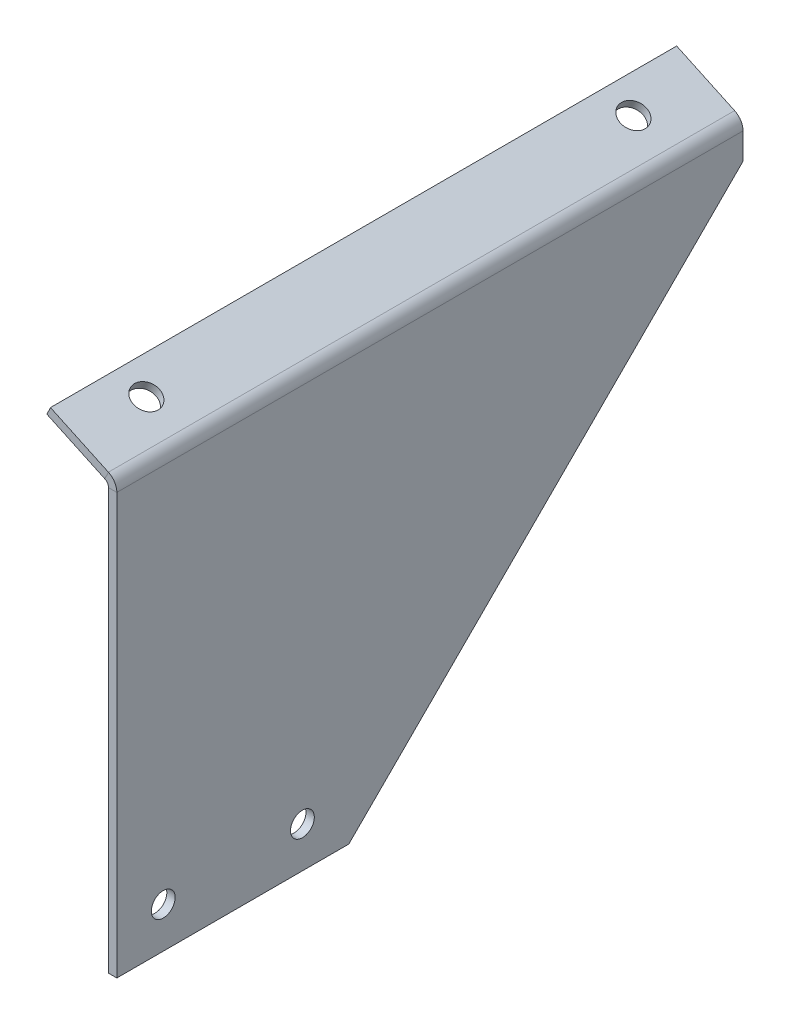
ISO-10303-21;
HEADER;
FILE_DESCRIPTION(('STEP AP214'),'2;1');
FILE_NAME('part.step','',(''),(''),'','','');
FILE_SCHEMA(('AUTOMOTIVE_DESIGN { 1 0 10303 214 1 1 1 1 }'));
ENDSEC;
DATA;
#1=APPLICATION_CONTEXT('core data for automotive mechanical design processes');
#2=APPLICATION_PROTOCOL_DEFINITION('international standard','automotive_design',2000,#1);
#3=PRODUCT_CONTEXT('',#1,'mechanical');
#4=PRODUCT('Part','Part','',(#3));
#5=PRODUCT_RELATED_PRODUCT_CATEGORY('part','',(#4));
#6=PRODUCT_DEFINITION_FORMATION('','',#4);
#7=PRODUCT_DEFINITION_CONTEXT('part definition',#1,'design');
#8=PRODUCT_DEFINITION('design','',#6,#7);
#9=PRODUCT_DEFINITION_SHAPE('','',#8);
#10=(LENGTH_UNIT() NAMED_UNIT(*) SI_UNIT(.MILLI.,.METRE.));
#11=(NAMED_UNIT(*) PLANE_ANGLE_UNIT() SI_UNIT($,.RADIAN.));
#12=(NAMED_UNIT(*) SI_UNIT($,.STERADIAN.) SOLID_ANGLE_UNIT());
#13=UNCERTAINTY_MEASURE_WITH_UNIT(LENGTH_MEASURE(1.E-05),#10,'distance_accuracy_value','');
#14=(GEOMETRIC_REPRESENTATION_CONTEXT(3) GLOBAL_UNCERTAINTY_ASSIGNED_CONTEXT((#13)) GLOBAL_UNIT_ASSIGNED_CONTEXT((#10,
#11,#12)) REPRESENTATION_CONTEXT('',''));
#15=CARTESIAN_POINT('',(0.,0.,0.));
#16=DIRECTION('',(0.,0.,1.));
#17=DIRECTION('',(1.,0.,0.));
#18=AXIS2_PLACEMENT_3D('',#15,#16,#17);
#19=CARTESIAN_POINT('',(103.876646538922,66.7332248992325,31.75));
#20=DIRECTION('',(0.422618261740697,0.906307787036651,0.));
#21=DIRECTION('',(0.,0.,-1.));
#22=AXIS2_PLACEMENT_3D('',#19,#20,#21);
#23=PLANE('',#22);
#24=CARTESIAN_POINT('',(-11.9380691662453,120.738513759596,12.7));
#25=DIRECTION('',(0.422618261740697,0.906307787036651,0.));
#26=DIRECTION('',(0.,0.,-1.));
#27=AXIS2_PLACEMENT_3D('',#24,#25,#26);
#28=CIRCLE('',#27,3.56869999999998);
#29=CARTESIAN_POINT('',(-11.9380691662453,120.738513759596,9.13130000000002));
#30=VERTEX_POINT('',#29);
#31=EDGE_CURVE('E189',#30,#30,#28,.F.);
#32=ORIENTED_EDGE('',*,*,#31,.F.);
#33=EDGE_LOOP('',(#32));
#34=FACE_BOUND('',#33,.T.);
#35=CARTESIAN_POINT('',(-11.9380691662453,120.738513759596,-120.65));
#36=DIRECTION('',(0.422618261740697,0.906307787036651,0.));
#37=DIRECTION('',(0.,0.,-1.));
#38=AXIS2_PLACEMENT_3D('',#35,#36,#37);
#39=CIRCLE('',#38,3.5687);
#40=CARTESIAN_POINT('',(-11.9380691662453,120.738513759596,-124.2187));
#41=VERTEX_POINT('',#40);
#42=EDGE_CURVE('E182',#41,#41,#39,.F.);
#43=ORIENTED_EDGE('',*,*,#42,.F.);
#44=EDGE_LOOP('',(#43));
#45=FACE_BOUND('',#44,.T.);
#46=DIRECTION('',(-0.906307787036651,0.422618261740697,0.));
#47=VECTOR('',#46,1.);
#48=CARTESIAN_POINT('',(6.0407209283152,112.354866254141,-139.7));
#49=LINE('',#48,#47);
#50=CARTESIAN_POINT('',(-3.28325373832147,116.702707045637,-139.7));
#51=VERTEX_POINT('',#50);
#52=CARTESIAN_POINT('',(-19.1433973347441,124.098413464087,-139.7));
#53=VERTEX_POINT('',#52);
#54=EDGE_CURVE('E46',#51,#53,#49,.T.);
#55=ORIENTED_EDGE('',*,*,#54,.F.);
#56=DIRECTION('',(0.,0.,1.));
#57=VECTOR('',#56,1.);
#58=CARTESIAN_POINT('',(-3.28325373832147,116.702707045637,31.75));
#59=LINE('',#58,#57);
#60=CARTESIAN_POINT('',(-3.28325373832147,116.702707045637,31.75));
#61=VERTEX_POINT('',#60);
#62=EDGE_CURVE('E139',#51,#61,#59,.T.);
#63=ORIENTED_EDGE('',*,*,#62,.T.);
#64=DIRECTION('',(0.906307787036651,-0.422618261740697,0.));
#65=VECTOR('',#64,1.);
#66=CARTESIAN_POINT('',(-19.1433973347441,124.098413464087,31.75));
#67=LINE('',#66,#65);
#68=CARTESIAN_POINT('',(-19.1433973347441,124.098413464087,31.75));
#69=VERTEX_POINT('',#68);
#70=EDGE_CURVE('E198',#69,#61,#67,.T.);
#71=ORIENTED_EDGE('',*,*,#70,.F.);
#72=DIRECTION('',(0.,0.,1.));
#73=VECTOR('',#72,1.);
#74=CARTESIAN_POINT('',(-19.1433973347441,124.098413464087,-139.7));
#75=LINE('',#74,#73);
#76=EDGE_CURVE('E192',#53,#69,#75,.T.);
#77=ORIENTED_EDGE('',*,*,#76,.F.);
#78=EDGE_LOOP('',(#55,#63,#71,#77));
#79=FACE_BOUND('',#78,.T.);
#80=ADVANCED_FACE('F42',(#34,#45,#79),#23,.F.);
#81=CARTESIAN_POINT('',(-19.1433973347441,124.098413464087,31.75));
#82=DIRECTION('',(0.,0.,1.));
#83=DIRECTION('',(0.906307787036651,-0.422618261740697,0.));
#84=AXIS2_PLACEMENT_3D('',#81,#82,#83);
#85=PLANE('',#84);
#86=DIRECTION('',(-0.422618261740697,-0.906307787036651,0.));
#87=VECTOR('',#86,1.);
#88=CARTESIAN_POINT('',(-3.28325373832147,116.702707045637,31.75));
#89=LINE('',#88,#87);
#90=CARTESIAN_POINT('',(-2.31714839198224,118.774526646803,31.75));
#91=VERTEX_POINT('',#90);
#92=EDGE_CURVE('E12',#91,#61,#89,.T.);
#93=ORIENTED_EDGE('',*,*,#92,.F.);
#94=DIRECTION('',(0.906307787036651,-0.422618261740697,0.));
#95=VECTOR('',#94,1.);
#96=CARTESIAN_POINT('',(-18.1772919884048,126.170233065252,31.75));
#97=LINE('',#96,#95);
#98=CARTESIAN_POINT('',(-18.1772919884048,126.170233065252,31.75));
#99=VERTEX_POINT('',#98);
#100=EDGE_CURVE('E59',#99,#91,#97,.T.);
#101=ORIENTED_EDGE('',*,*,#100,.F.);
#102=DIRECTION('',(0.422618261740697,0.906307787036651,0.));
#103=VECTOR('',#102,1.);
#104=CARTESIAN_POINT('',(-19.1433973347441,124.098413464087,31.75));
#105=LINE('',#104,#103);
#106=EDGE_CURVE('E199',#69,#99,#105,.T.);
#107=ORIENTED_EDGE('',*,*,#106,.F.);
#108=ORIENTED_EDGE('',*,*,#70,.T.);
#109=EDGE_LOOP('',(#93,#101,#107,#108));
#110=FACE_BOUND('',#109,.T.);
#111=ADVANCED_FACE('F44',(#110),#85,.T.);
#112=CARTESIAN_POINT('',(-19.1433973347441,124.098413464087,-139.7));
#113=DIRECTION('',(-0.906307787036651,0.422618261740697,0.));
#114=DIRECTION('',(0.,0.,1.));
#115=AXIS2_PLACEMENT_3D('',#112,#113,#114);
#116=PLANE('',#115);
#117=DIRECTION('',(0.,0.,1.));
#118=VECTOR('',#117,1.);
#119=CARTESIAN_POINT('',(-18.1772919884049,126.170233065252,-139.7));
#120=LINE('',#119,#118);
#121=CARTESIAN_POINT('',(-18.1772919884049,126.170233065252,-139.7));
#122=VERTEX_POINT('',#121);
#123=EDGE_CURVE('E196',#122,#99,#120,.T.);
#124=ORIENTED_EDGE('',*,*,#123,.F.);
#125=DIRECTION('',(0.422618261740697,0.906307787036651,0.));
#126=VECTOR('',#125,1.);
#127=CARTESIAN_POINT('',(-19.1433973347441,124.098413464087,-139.7));
#128=LINE('',#127,#126);
#129=EDGE_CURVE('E195',#53,#122,#128,.T.);
#130=ORIENTED_EDGE('',*,*,#129,.F.);
#131=ORIENTED_EDGE('',*,*,#76,.T.);
#132=ORIENTED_EDGE('',*,*,#106,.T.);
#133=EDGE_LOOP('',(#124,#130,#131,#132));
#134=FACE_BOUND('',#133,.T.);
#135=ADVANCED_FACE('F215',(#134),#116,.T.);
#136=CARTESIAN_POINT('',(6.0407209283152,112.354866254141,-139.7));
#137=DIRECTION('',(0.,0.,-1.));
#138=DIRECTION('',(-0.422618261740697,-0.906307787036651,0.));
#139=AXIS2_PLACEMENT_3D('',#136,#137,#138);
#140=PLANE('',#139);
#141=DIRECTION('',(0.422618261740697,0.906307787036651,0.));
#142=VECTOR('',#141,1.);
#143=CARTESIAN_POINT('',(-3.28325373832147,116.702707045637,-139.7));
#144=LINE('',#143,#142);
#145=CARTESIAN_POINT('',(-2.31714839198224,118.774526646803,-139.7));
#146=VERTEX_POINT('',#145);
#147=EDGE_CURVE('E203',#51,#146,#144,.T.);
#148=ORIENTED_EDGE('',*,*,#147,.F.);
#149=ORIENTED_EDGE('',*,*,#54,.T.);
#150=ORIENTED_EDGE('',*,*,#129,.T.);
#151=DIRECTION('',(-0.906307787036651,0.422618261740697,0.));
#152=VECTOR('',#151,1.);
#153=CARTESIAN_POINT('',(7.00682627465443,114.426685855307,-139.7));
#154=LINE('',#153,#152);
#155=EDGE_CURVE('E67',#146,#122,#154,.T.);
#156=ORIENTED_EDGE('',*,*,#155,.F.);
#157=EDGE_LOOP('',(#148,#149,#150,#156));
#158=FACE_BOUND('',#157,.T.);
#159=ADVANCED_FACE('F212',(#158),#140,.T.);
#160=CARTESIAN_POINT('',(104.842751885261,68.8050445003983,31.75));
#161=DIRECTION('',(0.422618261740697,0.906307787036651,0.));
#162=DIRECTION('',(0.,0.,-1.));
#163=AXIS2_PLACEMENT_3D('',#160,#161,#162);
#164=PLANE('',#163);
#165=DIRECTION('',(0.,0.,1.));
#166=VECTOR('',#165,1.);
#167=CARTESIAN_POINT('',(-2.31714839198224,118.774526646803,31.75));
#168=LINE('',#167,#166);
#169=EDGE_CURVE('E51',#146,#91,#168,.T.);
#170=ORIENTED_EDGE('',*,*,#169,.F.);
#171=ORIENTED_EDGE('',*,*,#155,.T.);
#172=ORIENTED_EDGE('',*,*,#123,.T.);
#173=ORIENTED_EDGE('',*,*,#100,.T.);
#174=EDGE_LOOP('',(#170,#171,#172,#173));
#175=FACE_BOUND('',#174,.T.);
#176=CARTESIAN_POINT('',(-10.9719638199061,122.810333360761,-120.65));
#177=DIRECTION('',(0.422618261740697,0.906307787036651,0.));
#178=DIRECTION('',(0.,0.,-1.));
#179=AXIS2_PLACEMENT_3D('',#176,#177,#178);
#180=CIRCLE('',#179,3.5687);
#181=CARTESIAN_POINT('',(-10.9719638199061,122.810333360761,-124.2187));
#182=VERTEX_POINT('',#181);
#183=EDGE_CURVE('E179',#182,#182,#180,.T.);
#184=ORIENTED_EDGE('',*,*,#183,.F.);
#185=EDGE_LOOP('',(#184));
#186=FACE_BOUND('',#185,.T.);
#187=CARTESIAN_POINT('',(-10.9719638199061,122.810333360761,12.7));
#188=DIRECTION('',(0.422618261740697,0.906307787036651,0.));
#189=DIRECTION('',(0.,0.,-1.));
#190=AXIS2_PLACEMENT_3D('',#187,#188,#189);
#191=CIRCLE('',#190,3.56869999999998);
#192=CARTESIAN_POINT('',(-10.9719638199061,122.810333360761,9.13130000000002));
#193=VERTEX_POINT('',#192);
#194=EDGE_CURVE('E186',#193,#193,#191,.T.);
#195=ORIENTED_EDGE('',*,*,#194,.F.);
#196=EDGE_LOOP('',(#195));
#197=FACE_BOUND('',#196,.T.);
#198=ADVANCED_FACE('F208',(#175,#186,#197),#164,.T.);
#199=CARTESIAN_POINT('',(-11.9384917845071,120.737607451809,12.7));
#200=DIRECTION('',(0.422618261740697,0.906307787036651,0.));
#201=DIRECTION('',(0.,0.,-1.));
#202=AXIS2_PLACEMENT_3D('',#199,#200,#201);
#203=CYLINDRICAL_SURFACE('',#202,3.56869999999998);
#204=ORIENTED_EDGE('',*,*,#194,.T.);
#205=EDGE_LOOP('',(#204));
#206=FACE_BOUND('',#205,.T.);
#207=ORIENTED_EDGE('',*,*,#31,.T.);
#208=EDGE_LOOP('',(#207));
#209=FACE_BOUND('',#208,.T.);
#210=ADVANCED_FACE('F279',(#206,#209),#203,.F.);
#211=CARTESIAN_POINT('',(-11.9384917845071,120.737607451809,-120.65));
#212=DIRECTION('',(0.422618261740697,0.906307787036651,0.));
#213=DIRECTION('',(0.,0.,-1.));
#214=AXIS2_PLACEMENT_3D('',#211,#212,#213);
#215=CYLINDRICAL_SURFACE('',#214,3.5687);
#216=ORIENTED_EDGE('',*,*,#183,.T.);
#217=EDGE_LOOP('',(#216));
#218=FACE_BOUND('',#217,.T.);
#219=ORIENTED_EDGE('',*,*,#42,.T.);
#220=EDGE_LOOP('',(#219));
#221=FACE_BOUND('',#220,.T.);
#222=ADVANCED_FACE('F283',(#218,#221),#215,.F.);
#223=CARTESIAN_POINT('',(-2.287,11.1252,-19.05));
#224=DIRECTION('',(1.,0.,0.));
#225=DIRECTION('',(0.,0.,-1.));
#226=AXIS2_PLACEMENT_3D('',#223,#224,#225);
#227=CYLINDRICAL_SURFACE('',#226,3.2639);
#228=CARTESIAN_POINT('',(0.,11.1252,-19.05));
#229=DIRECTION('',(1.,0.,0.));
#230=DIRECTION('',(0.,0.,-1.));
#231=AXIS2_PLACEMENT_3D('',#228,#229,#230);
#232=CIRCLE('',#231,3.2639);
#233=CARTESIAN_POINT('',(0.,11.1252,-22.3139));
#234=VERTEX_POINT('',#233);
#235=EDGE_CURVE('E153',#234,#234,#232,.T.);
#236=ORIENTED_EDGE('',*,*,#235,.T.);
#237=EDGE_LOOP('',(#236));
#238=FACE_BOUND('',#237,.T.);
#239=CARTESIAN_POINT('',(-2.286,11.1252,-19.05));
#240=DIRECTION('',(1.,0.,0.));
#241=DIRECTION('',(0.,0.,-1.));
#242=AXIS2_PLACEMENT_3D('',#239,#240,#241);
#243=CIRCLE('',#242,3.2639);
#244=CARTESIAN_POINT('',(-2.286,11.1252,-22.3139));
#245=VERTEX_POINT('',#244);
#246=EDGE_CURVE('E174',#245,#245,#243,.F.);
#247=ORIENTED_EDGE('',*,*,#246,.T.);
#248=EDGE_LOOP('',(#247));
#249=FACE_BOUND('',#248,.T.);
#250=ADVANCED_FACE('F288',(#238,#249),#227,.F.);
#251=CARTESIAN_POINT('',(-2.287,11.1252,19.05));
#252=DIRECTION('',(1.,0.,0.));
#253=DIRECTION('',(0.,0.,-1.));
#254=AXIS2_PLACEMENT_3D('',#251,#252,#253);
#255=CYLINDRICAL_SURFACE('',#254,3.2639);
#256=CARTESIAN_POINT('',(0.,11.1252,19.05));
#257=DIRECTION('',(1.,0.,0.));
#258=DIRECTION('',(0.,0.,-1.));
#259=AXIS2_PLACEMENT_3D('',#256,#257,#258);
#260=CIRCLE('',#259,3.2639);
#261=CARTESIAN_POINT('',(0.,11.1252,15.7861));
#262=VERTEX_POINT('',#261);
#263=EDGE_CURVE('E171',#262,#262,#260,.T.);
#264=ORIENTED_EDGE('',*,*,#263,.T.);
#265=EDGE_LOOP('',(#264));
#266=FACE_BOUND('',#265,.T.);
#267=CARTESIAN_POINT('',(-2.286,11.1252,19.05));
#268=DIRECTION('',(1.,0.,0.));
#269=DIRECTION('',(0.,0.,-1.));
#270=AXIS2_PLACEMENT_3D('',#267,#268,#269);
#271=CIRCLE('',#270,3.2639);
#272=CARTESIAN_POINT('',(-2.286,11.1252,15.7861));
#273=VERTEX_POINT('',#272);
#274=EDGE_CURVE('E168',#273,#273,#271,.F.);
#275=ORIENTED_EDGE('',*,*,#274,.T.);
#276=EDGE_LOOP('',(#275));
#277=FACE_BOUND('',#276,.T.);
#278=ADVANCED_FACE('F296',(#266,#277),#255,.F.);
#279=CARTESIAN_POINT('',(-2.286,0.,31.75));
#280=DIRECTION('',(0.,-1.,0.));
#281=DIRECTION('',(0.,0.,-1.));
#282=AXIS2_PLACEMENT_3D('',#279,#280,#281);
#283=PLANE('',#282);
#284=DIRECTION('',(0.,0.,-1.));
#285=VECTOR('',#284,1.);
#286=CARTESIAN_POINT('',(0.,0.,31.75));
#287=LINE('',#286,#285);
#288=CARTESIAN_POINT('',(0.,0.,31.75));
#289=VERTEX_POINT('',#288);
#290=CARTESIAN_POINT('',(0.,0.,-31.75));
#291=VERTEX_POINT('',#290);
#292=EDGE_CURVE('E240',#289,#291,#287,.T.);
#293=ORIENTED_EDGE('',*,*,#292,.F.);
#294=DIRECTION('',(1.,0.,0.));
#295=VECTOR('',#294,1.);
#296=CARTESIAN_POINT('',(-2.286,0.,31.75));
#297=LINE('',#296,#295);
#298=CARTESIAN_POINT('',(-2.286,0.,31.75));
#299=VERTEX_POINT('',#298);
#300=EDGE_CURVE('E183',#299,#289,#297,.T.);
#301=ORIENTED_EDGE('',*,*,#300,.F.);
#302=DIRECTION('',(0.,0.,-1.));
#303=VECTOR('',#302,1.);
#304=CARTESIAN_POINT('',(-2.286,0.,31.75));
#305=LINE('',#304,#303);
#306=CARTESIAN_POINT('',(-2.286,0.,-31.75));
#307=VERTEX_POINT('',#306);
#308=EDGE_CURVE('E165',#299,#307,#305,.T.);
#309=ORIENTED_EDGE('',*,*,#308,.T.);
#310=DIRECTION('',(1.,0.,0.));
#311=VECTOR('',#310,1.);
#312=CARTESIAN_POINT('',(-2.286,0.,-31.75));
#313=LINE('',#312,#311);
#314=EDGE_CURVE('E163',#307,#291,#313,.T.);
#315=ORIENTED_EDGE('',*,*,#314,.T.);
#316=EDGE_LOOP('',(#293,#301,#309,#315));
#317=FACE_BOUND('',#316,.T.);
#318=ADVANCED_FACE('F253',(#317),#283,.T.);
#319=CARTESIAN_POINT('',(-2.286,0.,-31.75));
#320=DIRECTION('',(0.,-0.707106781186546,-0.707106781186549));
#321=DIRECTION('',(0.,0.707106781186549,-0.707106781186546));
#322=AXIS2_PLACEMENT_3D('',#319,#320,#321);
#323=PLANE('',#322);
#324=DIRECTION('',(0.,0.707106781186549,-0.707106781186546));
#325=VECTOR('',#324,1.);
#326=CARTESIAN_POINT('',(0.,0.,-31.75));
#327=LINE('',#326,#325);
#328=CARTESIAN_POINT('',(0.,107.95,-139.7));
#329=VERTEX_POINT('',#328);
#330=EDGE_CURVE('E237',#291,#329,#327,.T.);
#331=ORIENTED_EDGE('',*,*,#330,.F.);
#332=ORIENTED_EDGE('',*,*,#314,.F.);
#333=DIRECTION('',(0.,0.707106781186549,-0.707106781186546));
#334=VECTOR('',#333,1.);
#335=CARTESIAN_POINT('',(-2.286,0.,-31.75));
#336=LINE('',#335,#334);
#337=CARTESIAN_POINT('',(-2.286,107.95,-139.7));
#338=VERTEX_POINT('',#337);
#339=EDGE_CURVE('E158',#307,#338,#336,.T.);
#340=ORIENTED_EDGE('',*,*,#339,.T.);
#341=DIRECTION('',(1.,0.,0.));
#342=VECTOR('',#341,1.);
#343=CARTESIAN_POINT('',(-2.286,107.95,-139.7));
#344=LINE('',#343,#342);
#345=EDGE_CURVE('E156',#338,#329,#344,.T.);
#346=ORIENTED_EDGE('',*,*,#345,.T.);
#347=EDGE_LOOP('',(#331,#332,#340,#346));
#348=FACE_BOUND('',#347,.T.);
#349=ADVANCED_FACE('F250',(#348),#323,.T.);
#350=CARTESIAN_POINT('',(-2.286,0.,31.75));
#351=DIRECTION('',(1.,0.,0.));
#352=DIRECTION('',(0.,0.,-1.));
#353=AXIS2_PLACEMENT_3D('',#350,#351,#352);
#354=PLANE('',#353);
#355=DIRECTION('',(0.,0.,1.));
#356=VECTOR('',#355,1.);
#357=CARTESIAN_POINT('',(-2.286,115.137332235867,31.75));
#358=LINE('',#357,#356);
#359=CARTESIAN_POINT('',(-2.286,115.137332235867,-139.7));
#360=VERTEX_POINT('',#359);
#361=CARTESIAN_POINT('',(-2.286,115.137332235867,31.75));
#362=VERTEX_POINT('',#361);
#363=EDGE_CURVE('E136',#360,#362,#358,.T.);
#364=ORIENTED_EDGE('',*,*,#363,.F.);
#365=DIRECTION('',(0.,1.,0.));
#366=VECTOR('',#365,1.);
#367=CARTESIAN_POINT('',(-2.286,107.95,-139.7));
#368=LINE('',#367,#366);
#369=EDGE_CURVE('E130',#338,#360,#368,.T.);
#370=ORIENTED_EDGE('',*,*,#369,.F.);
#371=ORIENTED_EDGE('',*,*,#339,.F.);
#372=ORIENTED_EDGE('',*,*,#308,.F.);
#373=DIRECTION('',(0.,-1.,0.));
#374=VECTOR('',#373,1.);
#375=CARTESIAN_POINT('',(-2.286,135.7376,31.75));
#376=LINE('',#375,#374);
#377=EDGE_CURVE('E151',#362,#299,#376,.T.);
#378=ORIENTED_EDGE('',*,*,#377,.F.);
#379=EDGE_LOOP('',(#364,#370,#371,#372,#378));
#380=FACE_BOUND('',#379,.T.);
#381=ORIENTED_EDGE('',*,*,#274,.F.);
#382=EDGE_LOOP('',(#381));
#383=FACE_BOUND('',#382,.T.);
#384=ORIENTED_EDGE('',*,*,#246,.F.);
#385=EDGE_LOOP('',(#384));
#386=FACE_BOUND('',#385,.T.);
#387=ADVANCED_FACE('F146',(#380,#383,#386),#354,.F.);
#388=CARTESIAN_POINT('',(-2.286,107.95,-139.7));
#389=DIRECTION('',(0.,0.,-1.));
#390=DIRECTION('',(-1.,0.,0.));
#391=AXIS2_PLACEMENT_3D('',#388,#389,#390);
#392=PLANE('',#391);
#393=ORIENTED_EDGE('',*,*,#369,.T.);
#394=DIRECTION('',(1.,0.,0.));
#395=VECTOR('',#394,1.);
#396=CARTESIAN_POINT('',(-2.286,115.137332235867,-139.7));
#397=LINE('',#396,#395);
#398=CARTESIAN_POINT('',(0.,115.137332235867,-139.7));
#399=VERTEX_POINT('',#398);
#400=EDGE_CURVE('E117',#360,#399,#397,.T.);
#401=ORIENTED_EDGE('',*,*,#400,.T.);
#402=DIRECTION('',(0.,1.,0.));
#403=VECTOR('',#402,1.);
#404=CARTESIAN_POINT('',(0.,107.95,-139.7));
#405=LINE('',#404,#403);
#406=EDGE_CURVE('E129',#329,#399,#405,.T.);
#407=ORIENTED_EDGE('',*,*,#406,.F.);
#408=ORIENTED_EDGE('',*,*,#345,.F.);
#409=EDGE_LOOP('',(#393,#401,#407,#408));
#410=FACE_BOUND('',#409,.T.);
#411=ADVANCED_FACE('F155',(#410),#392,.T.);
#412=CARTESIAN_POINT('',(0.,0.,31.75));
#413=DIRECTION('',(1.,0.,0.));
#414=DIRECTION('',(0.,0.,-1.));
#415=AXIS2_PLACEMENT_3D('',#412,#413,#414);
#416=PLANE('',#415);
#417=ORIENTED_EDGE('',*,*,#263,.F.);
#418=EDGE_LOOP('',(#417));
#419=FACE_BOUND('',#418,.T.);
#420=ORIENTED_EDGE('',*,*,#235,.F.);
#421=EDGE_LOOP('',(#420));
#422=FACE_BOUND('',#421,.T.);
#423=ORIENTED_EDGE('',*,*,#406,.T.);
#424=DIRECTION('',(0.,0.,1.));
#425=VECTOR('',#424,1.);
#426=CARTESIAN_POINT('',(0.,115.137332235867,31.75));
#427=LINE('',#426,#425);
#428=CARTESIAN_POINT('',(0.,115.137332235867,31.75));
#429=VERTEX_POINT('',#428);
#430=EDGE_CURVE('E228',#399,#429,#427,.T.);
#431=ORIENTED_EDGE('',*,*,#430,.T.);
#432=DIRECTION('',(0.,-1.,0.));
#433=VECTOR('',#432,1.);
#434=CARTESIAN_POINT('',(0.,135.7376,31.75));
#435=LINE('',#434,#433);
#436=EDGE_CURVE('E243',#429,#289,#435,.T.);
#437=ORIENTED_EDGE('',*,*,#436,.T.);
#438=ORIENTED_EDGE('',*,*,#292,.T.);
#439=ORIENTED_EDGE('',*,*,#330,.T.);
#440=EDGE_LOOP('',(#423,#431,#437,#438,#439));
#441=FACE_BOUND('',#440,.T.);
#442=ADVANCED_FACE('F246',(#419,#422,#441),#416,.T.);
#443=CARTESIAN_POINT('',(-2.286,135.7376,31.75));
#444=DIRECTION('',(0.,0.,1.));
#445=DIRECTION('',(0.,-1.,0.));
#446=AXIS2_PLACEMENT_3D('',#443,#444,#445);
#447=PLANE('',#446);
#448=ORIENTED_EDGE('',*,*,#436,.F.);
#449=DIRECTION('',(-1.,0.,0.));
#450=VECTOR('',#449,1.);
#451=CARTESIAN_POINT('',(-2.286,115.137332235867,31.75));
#452=LINE('',#451,#450);
#453=EDGE_CURVE('E222',#429,#362,#452,.T.);
#454=ORIENTED_EDGE('',*,*,#453,.T.);
#455=ORIENTED_EDGE('',*,*,#377,.T.);
#456=ORIENTED_EDGE('',*,*,#300,.T.);
#457=EDGE_LOOP('',(#448,#454,#455,#456));
#458=FACE_BOUND('',#457,.T.);
#459=ADVANCED_FACE('F255',(#458),#447,.T.);
#460=CARTESIAN_POINT('',(-4.0132,115.137332235867,-139.7));
#461=DIRECTION('',(0.,0.,1.));
#462=DIRECTION('',(1.,0.,0.));
#463=AXIS2_PLACEMENT_3D('',#460,#461,#462);
#464=PLANE('',#463);
#465=ORIENTED_EDGE('',*,*,#147,.T.);
#466=CARTESIAN_POINT('',(-4.0132,115.137332235867,-139.7));
#467=DIRECTION('',(0.,0.,-1.));
#468=DIRECTION('',(-1.,0.,0.));
#469=AXIS2_PLACEMENT_3D('',#466,#467,#468);
#470=CIRCLE('',#469,4.0132);
#471=EDGE_CURVE('E124',#146,#399,#470,.T.);
#472=ORIENTED_EDGE('',*,*,#471,.T.);
#473=ORIENTED_EDGE('',*,*,#400,.F.);
#474=CARTESIAN_POINT('',(-4.0132,115.137332235867,-139.7));
#475=DIRECTION('',(0.,0.,-1.));
#476=DIRECTION('',(1.,0.,0.));
#477=AXIS2_PLACEMENT_3D('',#474,#475,#476);
#478=CIRCLE('',#477,1.7272);
#479=EDGE_CURVE('E121',#51,#360,#478,.T.);
#480=ORIENTED_EDGE('',*,*,#479,.F.);
#481=EDGE_LOOP('',(#465,#472,#473,#480));
#482=FACE_BOUND('',#481,.T.);
#483=ADVANCED_FACE('F120',(#482),#464,.F.);
#484=CARTESIAN_POINT('',(-4.0132,115.137332235867,31.75));
#485=DIRECTION('',(0.,0.,-1.));
#486=DIRECTION('',(0.,1.,0.));
#487=AXIS2_PLACEMENT_3D('',#484,#485,#486);
#488=PLANE('',#487);
#489=ORIENTED_EDGE('',*,*,#453,.F.);
#490=CARTESIAN_POINT('',(-4.0132,115.137332235867,31.75));
#491=DIRECTION('',(0.,0.,-1.));
#492=DIRECTION('',(-1.,0.,0.));
#493=AXIS2_PLACEMENT_3D('',#490,#491,#492);
#494=CIRCLE('',#493,4.0132);
#495=EDGE_CURVE('E141',#429,#91,#494,.F.);
#496=ORIENTED_EDGE('',*,*,#495,.T.);
#497=ORIENTED_EDGE('',*,*,#92,.T.);
#498=CARTESIAN_POINT('',(-4.0132,115.137332235867,31.75));
#499=DIRECTION('',(0.,0.,1.));
#500=DIRECTION('',(0.,1.,0.));
#501=AXIS2_PLACEMENT_3D('',#498,#499,#500);
#502=CIRCLE('',#501,1.7272);
#503=EDGE_CURVE('E140',#362,#61,#502,.T.);
#504=ORIENTED_EDGE('',*,*,#503,.F.);
#505=EDGE_LOOP('',(#489,#496,#497,#504));
#506=FACE_BOUND('',#505,.T.);
#507=ADVANCED_FACE('F221',(#506),#488,.F.);
#508=CARTESIAN_POINT('',(-4.0132,115.137332235867,117.518269887078));
#509=DIRECTION('',(0.,0.,-1.));
#510=DIRECTION('',(-1.,0.,0.));
#511=AXIS2_PLACEMENT_3D('',#508,#509,#510);
#512=CYLINDRICAL_SURFACE('',#511,1.7272);
#513=ORIENTED_EDGE('',*,*,#503,.T.);
#514=ORIENTED_EDGE('',*,*,#62,.F.);
#515=ORIENTED_EDGE('',*,*,#479,.T.);
#516=ORIENTED_EDGE('',*,*,#363,.T.);
#517=EDGE_LOOP('',(#513,#514,#515,#516));
#518=FACE_BOUND('',#517,.T.);
#519=ADVANCED_FACE('F135',(#518),#512,.F.);
#520=CARTESIAN_POINT('',(-4.0132,115.137332235867,117.518269887078));
#521=DIRECTION('',(0.,0.,-1.));
#522=DIRECTION('',(-1.,0.,0.));
#523=AXIS2_PLACEMENT_3D('',#520,#521,#522);
#524=CYLINDRICAL_SURFACE('',#523,4.0132);
#525=ORIENTED_EDGE('',*,*,#495,.F.);
#526=ORIENTED_EDGE('',*,*,#430,.F.);
#527=ORIENTED_EDGE('',*,*,#471,.F.);
#528=ORIENTED_EDGE('',*,*,#169,.T.);
#529=EDGE_LOOP('',(#525,#526,#527,#528));
#530=FACE_BOUND('',#529,.T.);
#531=ADVANCED_FACE('F226',(#530),#524,.T.);
#532=CLOSED_SHELL('',(#80,#111,#135,#159,#198,#210,#222,#250,#278,#318,#349,#387,#411,#442,#459,
#483,#507,#519,#531));
#533=MANIFOLD_SOLID_BREP('B2',#532);
#534=ADVANCED_BREP_SHAPE_REPRESENTATION('',(#18,#533),#14);
#535=SHAPE_DEFINITION_REPRESENTATION(#9,#534);
ENDSEC;
END-ISO-10303-21;
